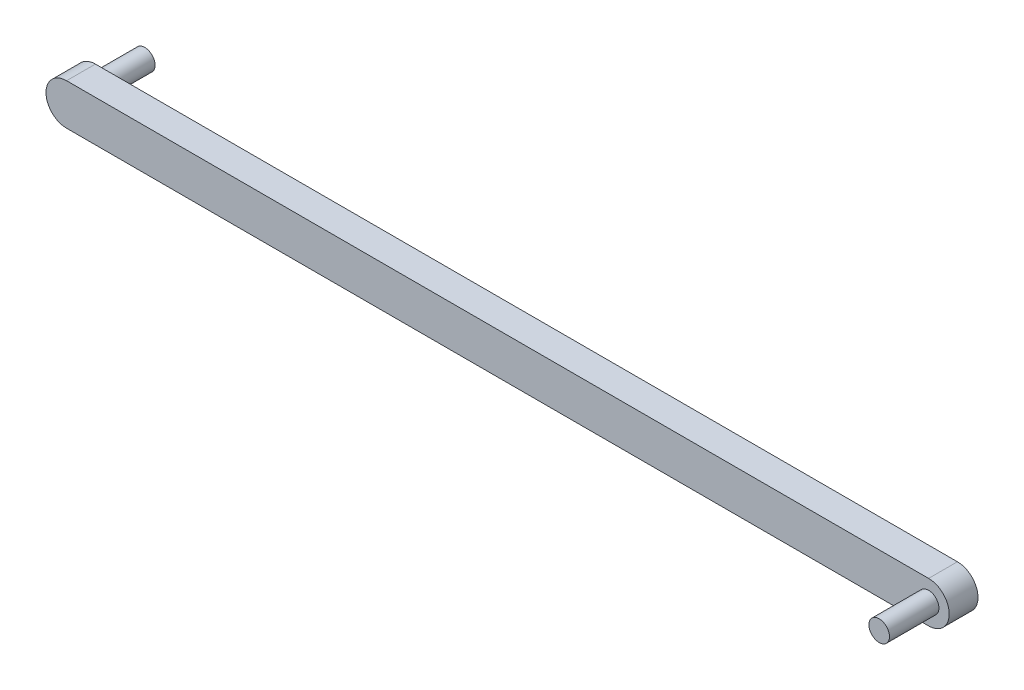
ISO-10303-21;
HEADER;
FILE_DESCRIPTION(('STEP AP214'),'2;1');
FILE_NAME('part.step','',(''),(''),'','','');
FILE_SCHEMA(('AUTOMOTIVE_DESIGN { 1 0 10303 214 1 1 1 1 }'));
ENDSEC;
DATA;
#1=APPLICATION_CONTEXT('core data for automotive mechanical design processes');
#2=APPLICATION_PROTOCOL_DEFINITION('international standard','automotive_design',2000,#1);
#3=PRODUCT_CONTEXT('',#1,'mechanical');
#4=PRODUCT('Part','Part','',(#3));
#5=PRODUCT_RELATED_PRODUCT_CATEGORY('part','',(#4));
#6=PRODUCT_DEFINITION_FORMATION('','',#4);
#7=PRODUCT_DEFINITION_CONTEXT('part definition',#1,'design');
#8=PRODUCT_DEFINITION('design','',#6,#7);
#9=PRODUCT_DEFINITION_SHAPE('','',#8);
#10=(LENGTH_UNIT() NAMED_UNIT(*) SI_UNIT(.MILLI.,.METRE.));
#11=(NAMED_UNIT(*) PLANE_ANGLE_UNIT() SI_UNIT($,.RADIAN.));
#12=(NAMED_UNIT(*) SI_UNIT($,.STERADIAN.) SOLID_ANGLE_UNIT());
#13=UNCERTAINTY_MEASURE_WITH_UNIT(LENGTH_MEASURE(1.E-05),#10,'distance_accuracy_value','');
#14=(GEOMETRIC_REPRESENTATION_CONTEXT(3) GLOBAL_UNCERTAINTY_ASSIGNED_CONTEXT((#13)) GLOBAL_UNIT_ASSIGNED_CONTEXT((#10,
#11,#12)) REPRESENTATION_CONTEXT('',''));
#15=CARTESIAN_POINT('',(0.,0.,0.));
#16=DIRECTION('',(0.,0.,1.));
#17=DIRECTION('',(1.,0.,0.));
#18=AXIS2_PLACEMENT_3D('',#15,#16,#17);
#19=CARTESIAN_POINT('',(-52.349,0.,3.5));
#20=DIRECTION('',(0.,0.,-1.));
#21=DIRECTION('',(-1.,0.,0.));
#22=AXIS2_PLACEMENT_3D('',#19,#20,#21);
#23=CYLINDRICAL_SURFACE('',#22,2.5);
#24=CARTESIAN_POINT('',(-52.349,0.,0.));
#25=DIRECTION('',(0.,0.,1.));
#26=DIRECTION('',(1.,0.,0.));
#27=AXIS2_PLACEMENT_3D('',#24,#25,#26);
#28=CIRCLE('',#27,2.5);
#29=CARTESIAN_POINT('',(-52.349,2.5,0.));
#30=VERTEX_POINT('',#29);
#31=CARTESIAN_POINT('',(-52.349,-2.5,0.));
#32=VERTEX_POINT('',#31);
#33=EDGE_CURVE('E110',#30,#32,#28,.T.);
#34=ORIENTED_EDGE('',*,*,#33,.T.);
#35=DIRECTION('',(0.,0.,-1.));
#36=VECTOR('',#35,1.);
#37=CARTESIAN_POINT('',(-52.349,-2.5,3.5));
#38=LINE('',#37,#36);
#39=CARTESIAN_POINT('',(-52.349,-2.5,3.5));
#40=VERTEX_POINT('',#39);
#41=EDGE_CURVE('E48',#40,#32,#38,.T.);
#42=ORIENTED_EDGE('',*,*,#41,.F.);
#43=CARTESIAN_POINT('',(-52.349,0.,3.5));
#44=DIRECTION('',(0.,0.,1.));
#45=DIRECTION('',(1.,0.,0.));
#46=AXIS2_PLACEMENT_3D('',#43,#44,#45);
#47=CIRCLE('',#46,2.5);
#48=CARTESIAN_POINT('',(-52.349,2.5,3.5));
#49=VERTEX_POINT('',#48);
#50=EDGE_CURVE('E92',#49,#40,#47,.T.);
#51=ORIENTED_EDGE('',*,*,#50,.F.);
#52=DIRECTION('',(0.,0.,-1.));
#53=VECTOR('',#52,1.);
#54=CARTESIAN_POINT('',(-52.349,2.5,3.5));
#55=LINE('',#54,#53);
#56=EDGE_CURVE('E106',#49,#30,#55,.T.);
#57=ORIENTED_EDGE('',*,*,#56,.T.);
#58=EDGE_LOOP('',(#34,#42,#51,#57));
#59=FACE_BOUND('',#58,.T.);
#60=ADVANCED_FACE('F39',(#59),#23,.T.);
#61=CARTESIAN_POINT('',(-52.349,-2.5,3.5));
#62=DIRECTION('',(0.,1.,0.));
#63=DIRECTION('',(0.,0.,1.));
#64=AXIS2_PLACEMENT_3D('',#61,#62,#63);
#65=PLANE('',#64);
#66=DIRECTION('',(1.,0.,0.));
#67=VECTOR('',#66,1.);
#68=CARTESIAN_POINT('',(-52.349,-2.5,0.));
#69=LINE('',#68,#67);
#70=CARTESIAN_POINT('',(52.349,-2.5,0.));
#71=VERTEX_POINT('',#70);
#72=EDGE_CURVE('E98',#32,#71,#69,.T.);
#73=ORIENTED_EDGE('',*,*,#72,.T.);
#74=DIRECTION('',(0.,0.,-1.));
#75=VECTOR('',#74,1.);
#76=CARTESIAN_POINT('',(52.349,-2.5,3.5));
#77=LINE('',#76,#75);
#78=CARTESIAN_POINT('',(52.349,-2.5,3.5));
#79=VERTEX_POINT('',#78);
#80=EDGE_CURVE('E96',#79,#71,#77,.T.);
#81=ORIENTED_EDGE('',*,*,#80,.F.);
#82=DIRECTION('',(1.,0.,0.));
#83=VECTOR('',#82,1.);
#84=CARTESIAN_POINT('',(-52.349,-2.5,3.5));
#85=LINE('',#84,#83);
#86=EDGE_CURVE('E87',#40,#79,#85,.T.);
#87=ORIENTED_EDGE('',*,*,#86,.F.);
#88=ORIENTED_EDGE('',*,*,#41,.T.);
#89=EDGE_LOOP('',(#73,#81,#87,#88));
#90=FACE_BOUND('',#89,.T.);
#91=ADVANCED_FACE('F97',(#90),#65,.F.);
#92=CARTESIAN_POINT('',(52.349,0.,3.5));
#93=DIRECTION('',(0.,0.,-1.));
#94=DIRECTION('',(-1.,0.,0.));
#95=AXIS2_PLACEMENT_3D('',#92,#93,#94);
#96=CYLINDRICAL_SURFACE('',#95,2.5);
#97=CARTESIAN_POINT('',(52.349,0.,0.));
#98=DIRECTION('',(0.,0.,1.));
#99=DIRECTION('',(1.,0.,0.));
#100=AXIS2_PLACEMENT_3D('',#97,#98,#99);
#101=CIRCLE('',#100,2.5);
#102=CARTESIAN_POINT('',(52.349,2.5,0.));
#103=VERTEX_POINT('',#102);
#104=EDGE_CURVE('E73',#71,#103,#101,.T.);
#105=ORIENTED_EDGE('',*,*,#104,.T.);
#106=DIRECTION('',(0.,0.,-1.));
#107=VECTOR('',#106,1.);
#108=CARTESIAN_POINT('',(52.349,2.5,3.5));
#109=LINE('',#108,#107);
#110=CARTESIAN_POINT('',(52.349,2.5,3.5));
#111=VERTEX_POINT('',#110);
#112=EDGE_CURVE('E100',#111,#103,#109,.T.);
#113=ORIENTED_EDGE('',*,*,#112,.F.);
#114=CARTESIAN_POINT('',(52.349,0.,3.5));
#115=DIRECTION('',(0.,0.,1.));
#116=DIRECTION('',(1.,0.,0.));
#117=AXIS2_PLACEMENT_3D('',#114,#115,#116);
#118=CIRCLE('',#117,2.5);
#119=EDGE_CURVE('E90',#79,#111,#118,.T.);
#120=ORIENTED_EDGE('',*,*,#119,.F.);
#121=ORIENTED_EDGE('',*,*,#80,.T.);
#122=EDGE_LOOP('',(#105,#113,#120,#121));
#123=FACE_BOUND('',#122,.T.);
#124=ADVANCED_FACE('F102',(#123),#96,.T.);
#125=CARTESIAN_POINT('',(-52.349,2.5,3.5));
#126=DIRECTION('',(0.,-1.,0.));
#127=DIRECTION('',(0.,0.,-1.));
#128=AXIS2_PLACEMENT_3D('',#125,#126,#127);
#129=PLANE('',#128);
#130=DIRECTION('',(-1.,0.,0.));
#131=VECTOR('',#130,1.);
#132=CARTESIAN_POINT('',(-52.349,2.5,0.));
#133=LINE('',#132,#131);
#134=EDGE_CURVE('E79',#103,#30,#133,.T.);
#135=ORIENTED_EDGE('',*,*,#134,.T.);
#136=ORIENTED_EDGE('',*,*,#56,.F.);
#137=DIRECTION('',(-1.,0.,0.));
#138=VECTOR('',#137,1.);
#139=CARTESIAN_POINT('',(-52.349,2.5,3.5));
#140=LINE('',#139,#138);
#141=EDGE_CURVE('E56',#111,#49,#140,.T.);
#142=ORIENTED_EDGE('',*,*,#141,.F.);
#143=ORIENTED_EDGE('',*,*,#112,.T.);
#144=EDGE_LOOP('',(#135,#136,#142,#143));
#145=FACE_BOUND('',#144,.T.);
#146=ADVANCED_FACE('F140',(#145),#129,.F.);
#147=CARTESIAN_POINT('',(-52.349,0.,3.5));
#148=DIRECTION('',(0.,0.,1.));
#149=DIRECTION('',(1.,0.,0.));
#150=AXIS2_PLACEMENT_3D('',#147,#148,#149);
#151=PLANE('',#150);
#152=CARTESIAN_POINT('',(52.349,0.,3.5));
#153=DIRECTION('',(0.,0.,1.));
#154=DIRECTION('',(1.,0.,0.));
#155=AXIS2_PLACEMENT_3D('',#152,#153,#154);
#156=CIRCLE('',#155,1.25);
#157=CARTESIAN_POINT('',(53.599,0.,3.5));
#158=VERTEX_POINT('',#157);
#159=EDGE_CURVE('E209',#158,#158,#156,.T.);
#160=ORIENTED_EDGE('',*,*,#159,.F.);
#161=EDGE_LOOP('',(#160));
#162=FACE_BOUND('',#161,.T.);
#163=ORIENTED_EDGE('',*,*,#50,.T.);
#164=ORIENTED_EDGE('',*,*,#86,.T.);
#165=ORIENTED_EDGE('',*,*,#119,.T.);
#166=ORIENTED_EDGE('',*,*,#141,.T.);
#167=EDGE_LOOP('',(#163,#164,#165,#166));
#168=FACE_BOUND('',#167,.T.);
#169=ADVANCED_FACE('F88',(#162,#168),#151,.T.);
#170=CARTESIAN_POINT('',(-52.349,0.,0.));
#171=DIRECTION('',(0.,0.,1.));
#172=DIRECTION('',(1.,0.,0.));
#173=AXIS2_PLACEMENT_3D('',#170,#171,#172);
#174=PLANE('',#173);
#175=CARTESIAN_POINT('',(-52.349,0.,0.));
#176=DIRECTION('',(0.,0.,1.));
#177=DIRECTION('',(1.,0.,0.));
#178=AXIS2_PLACEMENT_3D('',#175,#176,#177);
#179=CIRCLE('',#178,1.25);
#180=CARTESIAN_POINT('',(-51.099,0.,0.));
#181=VERTEX_POINT('',#180);
#182=EDGE_CURVE('E11',#181,#181,#179,.F.);
#183=ORIENTED_EDGE('',*,*,#182,.F.);
#184=EDGE_LOOP('',(#183));
#185=FACE_BOUND('',#184,.T.);
#186=ORIENTED_EDGE('',*,*,#33,.F.);
#187=ORIENTED_EDGE('',*,*,#134,.F.);
#188=ORIENTED_EDGE('',*,*,#104,.F.);
#189=ORIENTED_EDGE('',*,*,#72,.F.);
#190=EDGE_LOOP('',(#186,#187,#188,#189));
#191=FACE_BOUND('',#190,.T.);
#192=ADVANCED_FACE('F128',(#185,#191),#174,.F.);
#193=CARTESIAN_POINT('',(52.349,0.,9.5));
#194=DIRECTION('',(0.,0.,-1.));
#195=DIRECTION('',(-1.,0.,0.));
#196=AXIS2_PLACEMENT_3D('',#193,#194,#195);
#197=CYLINDRICAL_SURFACE('',#196,1.25);
#198=CARTESIAN_POINT('',(52.349,0.,9.5));
#199=DIRECTION('',(0.,0.,1.));
#200=DIRECTION('',(1.,0.,0.));
#201=AXIS2_PLACEMENT_3D('',#198,#199,#200);
#202=CIRCLE('',#201,1.25);
#203=CARTESIAN_POINT('',(53.599,0.,9.5));
#204=VERTEX_POINT('',#203);
#205=EDGE_CURVE('E114',#204,#204,#202,.T.);
#206=ORIENTED_EDGE('',*,*,#205,.F.);
#207=EDGE_LOOP('',(#206));
#208=FACE_BOUND('',#207,.T.);
#209=ORIENTED_EDGE('',*,*,#159,.T.);
#210=EDGE_LOOP('',(#209));
#211=FACE_BOUND('',#210,.T.);
#212=ADVANCED_FACE('F130',(#208,#211),#197,.T.);
#213=CARTESIAN_POINT('',(52.349,0.,9.5));
#214=DIRECTION('',(0.,0.,1.));
#215=DIRECTION('',(1.,0.,0.));
#216=AXIS2_PLACEMENT_3D('',#213,#214,#215);
#217=PLANE('',#216);
#218=ORIENTED_EDGE('',*,*,#205,.T.);
#219=EDGE_LOOP('',(#218));
#220=FACE_BOUND('',#219,.T.);
#221=ADVANCED_FACE('F137',(#220),#217,.T.);
#222=CARTESIAN_POINT('',(-52.349,0.,-6.));
#223=DIRECTION('',(0.,0.,1.));
#224=DIRECTION('',(1.,0.,0.));
#225=AXIS2_PLACEMENT_3D('',#222,#223,#224);
#226=CYLINDRICAL_SURFACE('',#225,1.25);
#227=CARTESIAN_POINT('',(-52.349,0.,-6.));
#228=DIRECTION('',(0.,0.,-1.));
#229=DIRECTION('',(-1.,0.,0.));
#230=AXIS2_PLACEMENT_3D('',#227,#228,#229);
#231=CIRCLE('',#230,1.25);
#232=CARTESIAN_POINT('',(-53.599,0.,-6.));
#233=VERTEX_POINT('',#232);
#234=EDGE_CURVE('E207',#233,#233,#231,.T.);
#235=ORIENTED_EDGE('',*,*,#234,.F.);
#236=EDGE_LOOP('',(#235));
#237=FACE_BOUND('',#236,.T.);
#238=ORIENTED_EDGE('',*,*,#182,.T.);
#239=EDGE_LOOP('',(#238));
#240=FACE_BOUND('',#239,.T.);
#241=ADVANCED_FACE('F177',(#237,#240),#226,.T.);
#242=CARTESIAN_POINT('',(-52.349,0.,-6.));
#243=DIRECTION('',(0.,0.,-1.));
#244=DIRECTION('',(-1.,0.,0.));
#245=AXIS2_PLACEMENT_3D('',#242,#243,#244);
#246=PLANE('',#245);
#247=ORIENTED_EDGE('',*,*,#234,.T.);
#248=EDGE_LOOP('',(#247));
#249=FACE_BOUND('',#248,.T.);
#250=ADVANCED_FACE('F191',(#249),#246,.T.);
#251=CLOSED_SHELL('',(#60,#91,#124,#146,#169,#192,#212,#221,#241,#250));
#252=MANIFOLD_SOLID_BREP('B2',#251);
#253=ADVANCED_BREP_SHAPE_REPRESENTATION('',(#18,#252),#14);
#254=SHAPE_DEFINITION_REPRESENTATION(#9,#253);
ENDSEC;
END-ISO-10303-21;
